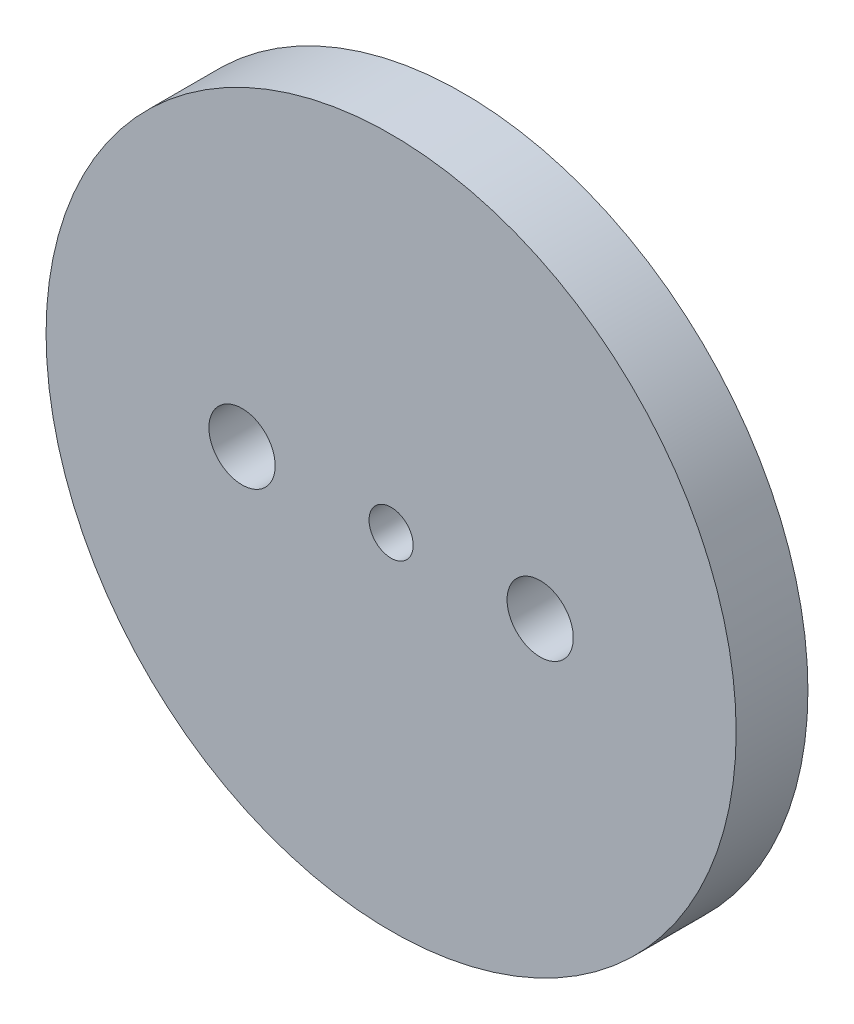
ISO-10303-21;
HEADER;
FILE_DESCRIPTION(('STEP AP214'),'2;1');
FILE_NAME('part.step','',(''),(''),'','','');
FILE_SCHEMA(('AUTOMOTIVE_DESIGN { 1 0 10303 214 1 1 1 1 }'));
ENDSEC;
DATA;
#1=APPLICATION_CONTEXT('core data for automotive mechanical design processes');
#2=APPLICATION_PROTOCOL_DEFINITION('international standard','automotive_design',2000,#1);
#3=PRODUCT_CONTEXT('',#1,'mechanical');
#4=PRODUCT('Part','Part','',(#3));
#5=PRODUCT_RELATED_PRODUCT_CATEGORY('part','',(#4));
#6=PRODUCT_DEFINITION_FORMATION('','',#4);
#7=PRODUCT_DEFINITION_CONTEXT('part definition',#1,'design');
#8=PRODUCT_DEFINITION('design','',#6,#7);
#9=PRODUCT_DEFINITION_SHAPE('','',#8);
#10=(LENGTH_UNIT() NAMED_UNIT(*) SI_UNIT(.MILLI.,.METRE.));
#11=(NAMED_UNIT(*) PLANE_ANGLE_UNIT() SI_UNIT($,.RADIAN.));
#12=(NAMED_UNIT(*) SI_UNIT($,.STERADIAN.) SOLID_ANGLE_UNIT());
#13=UNCERTAINTY_MEASURE_WITH_UNIT(LENGTH_MEASURE(1.E-05),#10,'distance_accuracy_value','');
#14=(GEOMETRIC_REPRESENTATION_CONTEXT(3) GLOBAL_UNCERTAINTY_ASSIGNED_CONTEXT((#13)) GLOBAL_UNIT_ASSIGNED_CONTEXT((#10,
#11,#12)) REPRESENTATION_CONTEXT('',''));
#15=CARTESIAN_POINT('',(0.,0.,0.));
#16=DIRECTION('',(0.,0.,1.));
#17=DIRECTION('',(1.,0.,0.));
#18=AXIS2_PLACEMENT_3D('',#15,#16,#17);
#19=CARTESIAN_POINT('',(0.,0.,13.));
#20=DIRECTION('',(0.,0.,1.));
#21=DIRECTION('',(1.,0.,0.));
#22=AXIS2_PLACEMENT_3D('',#19,#20,#21);
#23=PLANE('',#22);
#24=CARTESIAN_POINT('',(0.,0.,13.));
#25=DIRECTION('',(0.,0.,1.));
#26=DIRECTION('',(1.,0.,0.));
#27=AXIS2_PLACEMENT_3D('',#24,#25,#26);
#28=CIRCLE('',#27,4.);
#29=CARTESIAN_POINT('',(4.,0.,13.));
#30=VERTEX_POINT('',#29);
#31=EDGE_CURVE('E67',#30,#30,#28,.T.);
#32=ORIENTED_EDGE('',*,*,#31,.F.);
#33=EDGE_LOOP('',(#32));
#34=FACE_BOUND('',#33,.T.);
#35=CARTESIAN_POINT('',(27.,0.,13.));
#36=DIRECTION('',(0.,0.,1.));
#37=DIRECTION('',(1.,0.,0.));
#38=AXIS2_PLACEMENT_3D('',#35,#36,#37);
#39=CIRCLE('',#38,6.);
#40=CARTESIAN_POINT('',(21.,0.,13.));
#41=VERTEX_POINT('',#40);
#42=EDGE_CURVE('E49',#41,#41,#39,.T.);
#43=ORIENTED_EDGE('',*,*,#42,.F.);
#44=EDGE_LOOP('',(#43));
#45=FACE_BOUND('',#44,.T.);
#46=CARTESIAN_POINT('',(0.,0.,13.));
#47=DIRECTION('',(0.,0.,1.));
#48=DIRECTION('',(1.,0.,0.));
#49=AXIS2_PLACEMENT_3D('',#46,#47,#48);
#50=CIRCLE('',#49,62.5);
#51=CARTESIAN_POINT('',(-62.5,0.,13.));
#52=VERTEX_POINT('',#51);
#53=EDGE_CURVE('E10',#52,#52,#50,.T.);
#54=ORIENTED_EDGE('',*,*,#53,.T.);
#55=EDGE_LOOP('',(#54));
#56=FACE_BOUND('',#55,.T.);
#57=CARTESIAN_POINT('',(-27.,0.,13.));
#58=DIRECTION('',(0.,0.,1.));
#59=DIRECTION('',(-1.,0.,0.));
#60=AXIS2_PLACEMENT_3D('',#57,#58,#59);
#61=CIRCLE('',#60,6.);
#62=CARTESIAN_POINT('',(-33.,0.,13.));
#63=VERTEX_POINT('',#62);
#64=EDGE_CURVE('E55',#63,#63,#61,.T.);
#65=ORIENTED_EDGE('',*,*,#64,.F.);
#66=EDGE_LOOP('',(#65));
#67=FACE_BOUND('',#66,.T.);
#68=ADVANCED_FACE('F36',(#34,#45,#56,#67),#23,.T.);
#69=CARTESIAN_POINT('',(0.,0.,0.));
#70=DIRECTION('',(0.,0.,1.));
#71=DIRECTION('',(1.,0.,0.));
#72=AXIS2_PLACEMENT_3D('',#69,#70,#71);
#73=PLANE('',#72);
#74=CARTESIAN_POINT('',(0.,0.,0.));
#75=DIRECTION('',(0.,0.,1.));
#76=DIRECTION('',(1.,0.,0.));
#77=AXIS2_PLACEMENT_3D('',#74,#75,#76);
#78=CIRCLE('',#77,4.);
#79=CARTESIAN_POINT('',(4.,0.,0.));
#80=VERTEX_POINT('',#79);
#81=EDGE_CURVE('E63',#80,#80,#78,.T.);
#82=ORIENTED_EDGE('',*,*,#81,.T.);
#83=EDGE_LOOP('',(#82));
#84=FACE_BOUND('',#83,.T.);
#85=CARTESIAN_POINT('',(0.,0.,0.));
#86=DIRECTION('',(0.,0.,1.));
#87=DIRECTION('',(1.,0.,0.));
#88=AXIS2_PLACEMENT_3D('',#85,#86,#87);
#89=CIRCLE('',#88,62.5);
#90=CARTESIAN_POINT('',(-62.5,0.,0.));
#91=VERTEX_POINT('',#90);
#92=EDGE_CURVE('E40',#91,#91,#89,.T.);
#93=ORIENTED_EDGE('',*,*,#92,.F.);
#94=EDGE_LOOP('',(#93));
#95=FACE_BOUND('',#94,.T.);
#96=CARTESIAN_POINT('',(27.,0.,0.));
#97=DIRECTION('',(0.,0.,1.));
#98=DIRECTION('',(1.,0.,0.));
#99=AXIS2_PLACEMENT_3D('',#96,#97,#98);
#100=CIRCLE('',#99,6.);
#101=CARTESIAN_POINT('',(21.,0.,0.));
#102=VERTEX_POINT('',#101);
#103=EDGE_CURVE('E51',#102,#102,#100,.T.);
#104=ORIENTED_EDGE('',*,*,#103,.T.);
#105=EDGE_LOOP('',(#104));
#106=FACE_BOUND('',#105,.T.);
#107=CARTESIAN_POINT('',(-27.,0.,0.));
#108=DIRECTION('',(0.,0.,1.));
#109=DIRECTION('',(-1.,0.,0.));
#110=AXIS2_PLACEMENT_3D('',#107,#108,#109);
#111=CIRCLE('',#110,6.);
#112=CARTESIAN_POINT('',(-33.,0.,0.));
#113=VERTEX_POINT('',#112);
#114=EDGE_CURVE('E59',#113,#113,#111,.T.);
#115=ORIENTED_EDGE('',*,*,#114,.T.);
#116=EDGE_LOOP('',(#115));
#117=FACE_BOUND('',#116,.T.);
#118=ADVANCED_FACE('F75',(#84,#95,#106,#117),#73,.F.);
#119=CARTESIAN_POINT('',(0.,0.,13.));
#120=DIRECTION('',(0.,0.,-1.));
#121=DIRECTION('',(-1.,0.,0.));
#122=AXIS2_PLACEMENT_3D('',#119,#120,#121);
#123=CYLINDRICAL_SURFACE('',#122,62.5);
#124=CARTESIAN_POINT('',(-62.5,0.,13.));
#125=CARTESIAN_POINT('',(-62.5,0.,12.8645833333333));
#126=CARTESIAN_POINT('',(-62.5,0.,12.7291666666667));
#127=CARTESIAN_POINT('',(-62.5,0.,12.4583333333333));
#128=CARTESIAN_POINT('',(-62.5,0.,12.3229166666667));
#129=CARTESIAN_POINT('',(-62.5,0.,12.0520833333333));
#130=CARTESIAN_POINT('',(-62.5,0.,11.9166666666667));
#131=CARTESIAN_POINT('',(-62.5,0.,11.6458333333333));
#132=CARTESIAN_POINT('',(-62.5,0.,11.5104166666667));
#133=CARTESIAN_POINT('',(-62.5,0.,11.2395833333333));
#134=CARTESIAN_POINT('',(-62.5,0.,11.1041666666667));
#135=CARTESIAN_POINT('',(-62.5,0.,10.8333333333333));
#136=CARTESIAN_POINT('',(-62.5,0.,10.6979166666667));
#137=CARTESIAN_POINT('',(-62.5,0.,10.4270833333333));
#138=CARTESIAN_POINT('',(-62.5,0.,10.2916666666667));
#139=CARTESIAN_POINT('',(-62.5,0.,10.0208333333333));
#140=CARTESIAN_POINT('',(-62.5,0.,9.88541666666667));
#141=CARTESIAN_POINT('',(-62.5,0.,9.61458333333333));
#142=CARTESIAN_POINT('',(-62.5,0.,9.47916666666667));
#143=CARTESIAN_POINT('',(-62.5,0.,9.20833333333333));
#144=CARTESIAN_POINT('',(-62.5,0.,9.07291666666667));
#145=CARTESIAN_POINT('',(-62.5,0.,8.80208333333333));
#146=CARTESIAN_POINT('',(-62.5,0.,8.66666666666667));
#147=CARTESIAN_POINT('',(-62.5,0.,8.39583333333333));
#148=CARTESIAN_POINT('',(-62.5,0.,8.26041666666667));
#149=CARTESIAN_POINT('',(-62.5,0.,7.98958333333333));
#150=CARTESIAN_POINT('',(-62.5,0.,7.85416666666667));
#151=CARTESIAN_POINT('',(-62.5,0.,7.58333333333333));
#152=CARTESIAN_POINT('',(-62.5,0.,7.44791666666667));
#153=CARTESIAN_POINT('',(-62.5,0.,7.17708333333333));
#154=CARTESIAN_POINT('',(-62.5,0.,7.04166666666667));
#155=CARTESIAN_POINT('',(-62.5,0.,6.77083333333333));
#156=CARTESIAN_POINT('',(-62.5,0.,6.63541666666667));
#157=CARTESIAN_POINT('',(-62.5,0.,6.36458333333333));
#158=CARTESIAN_POINT('',(-62.5,0.,6.22916666666667));
#159=CARTESIAN_POINT('',(-62.5,0.,5.95833333333333));
#160=CARTESIAN_POINT('',(-62.5,0.,5.82291666666667));
#161=CARTESIAN_POINT('',(-62.5,0.,5.55208333333333));
#162=CARTESIAN_POINT('',(-62.5,0.,5.41666666666667));
#163=CARTESIAN_POINT('',(-62.5,0.,5.14583333333333));
#164=CARTESIAN_POINT('',(-62.5,0.,5.01041666666667));
#165=CARTESIAN_POINT('',(-62.5,0.,4.73958333333333));
#166=CARTESIAN_POINT('',(-62.5,0.,4.60416666666667));
#167=CARTESIAN_POINT('',(-62.5,0.,4.33333333333333));
#168=CARTESIAN_POINT('',(-62.5,0.,4.19791666666667));
#169=CARTESIAN_POINT('',(-62.5,0.,3.92708333333333));
#170=CARTESIAN_POINT('',(-62.5,0.,3.79166666666667));
#171=CARTESIAN_POINT('',(-62.5,0.,3.52083333333333));
#172=CARTESIAN_POINT('',(-62.5,0.,3.38541666666667));
#173=CARTESIAN_POINT('',(-62.5,0.,3.11458333333333));
#174=CARTESIAN_POINT('',(-62.5,0.,2.97916666666667));
#175=CARTESIAN_POINT('',(-62.5,0.,2.70833333333333));
#176=CARTESIAN_POINT('',(-62.5,0.,2.57291666666667));
#177=CARTESIAN_POINT('',(-62.5,0.,2.30208333333333));
#178=CARTESIAN_POINT('',(-62.5,0.,2.16666666666667));
#179=CARTESIAN_POINT('',(-62.5,0.,1.89583333333333));
#180=CARTESIAN_POINT('',(-62.5,0.,1.76041666666667));
#181=CARTESIAN_POINT('',(-62.5,0.,1.48958333333333));
#182=CARTESIAN_POINT('',(-62.5,0.,1.35416666666667));
#183=CARTESIAN_POINT('',(-62.5,0.,1.08333333333333));
#184=CARTESIAN_POINT('',(-62.5,0.,0.947916666666667));
#185=CARTESIAN_POINT('',(-62.5,0.,0.677083333333334));
#186=CARTESIAN_POINT('',(-62.5,0.,0.541666666666667));
#187=CARTESIAN_POINT('',(-62.5,0.,0.270833333333334));
#188=CARTESIAN_POINT('',(-62.5,0.,0.135416666666667));
#189=CARTESIAN_POINT('',(-62.5,0.,0.));
#190=B_SPLINE_CURVE_WITH_KNOTS('',3,(#124,#125,#126,#127,#128,#129,#130,#131,#132,#133,#134,
#135,#136,#137,#138,#139,#140,#141,#142,#143,#144,#145,#146,#147,#148,#149,#150,#151,#152,#153,
#154,#155,#156,#157,#158,#159,#160,#161,#162,#163,#164,#165,#166,#167,#168,#169,#170,#171,#172,
#173,#174,#175,#176,#177,#178,#179,#180,#181,#182,#183,#184,#185,#186,#187,#188,#189),
.UNSPECIFIED.,.F.,.F.,(4,2,2,2,2,2,2,2,2,2,2,2,2,2,2,2,2,2,2,2,2,2,2,2,2,2,2,2,2,2,2,2,4),(0.,
0.406249999999999,0.812499999999999,1.21875,1.625,2.03125,2.4375,2.84375,3.25,3.65625,4.0625,
4.46875,4.875,5.28125,5.6875,6.09375,6.5,6.90625,7.3125,7.71875,8.125,8.53125,8.9375,9.34375,
9.75,10.15625,10.5625,10.96875,11.375,11.78125,12.1875,12.59375,13.),.UNSPECIFIED.);
#191=EDGE_CURVE('BSEAM38',#52,#91,#190,.T.);
#192=ORIENTED_EDGE('',*,*,#53,.F.);
#193=ORIENTED_EDGE('',*,*,#92,.T.);
#194=ORIENTED_EDGE('',*,*,#191,.T.);
#195=ORIENTED_EDGE('',*,*,#191,.F.);
#196=EDGE_LOOP('',(#192,#194,#193,#195));
#197=FACE_BOUND('',#196,.T.);
#198=ADVANCED_FACE('F38',(#197),#123,.T.);
#199=CARTESIAN_POINT('',(27.,0.,13.));
#200=DIRECTION('',(0.,0.,-1.));
#201=DIRECTION('',(-1.,0.,0.));
#202=AXIS2_PLACEMENT_3D('',#199,#200,#201);
#203=CYLINDRICAL_SURFACE('',#202,6.);
#204=CARTESIAN_POINT('',(21.,0.,13.));
#205=CARTESIAN_POINT('',(21.,0.,12.8645833333333));
#206=CARTESIAN_POINT('',(21.,0.,12.7291666666667));
#207=CARTESIAN_POINT('',(21.,0.,12.4583333333333));
#208=CARTESIAN_POINT('',(21.,0.,12.3229166666667));
#209=CARTESIAN_POINT('',(21.,0.,12.0520833333333));
#210=CARTESIAN_POINT('',(21.,0.,11.9166666666667));
#211=CARTESIAN_POINT('',(21.,0.,11.6458333333333));
#212=CARTESIAN_POINT('',(21.,0.,11.5104166666667));
#213=CARTESIAN_POINT('',(21.,0.,11.2395833333333));
#214=CARTESIAN_POINT('',(21.,0.,11.1041666666667));
#215=CARTESIAN_POINT('',(21.,0.,10.8333333333333));
#216=CARTESIAN_POINT('',(21.,0.,10.6979166666667));
#217=CARTESIAN_POINT('',(21.,0.,10.4270833333333));
#218=CARTESIAN_POINT('',(21.,0.,10.2916666666667));
#219=CARTESIAN_POINT('',(21.,0.,10.0208333333333));
#220=CARTESIAN_POINT('',(21.,0.,9.88541666666667));
#221=CARTESIAN_POINT('',(21.,0.,9.61458333333333));
#222=CARTESIAN_POINT('',(21.,0.,9.47916666666667));
#223=CARTESIAN_POINT('',(21.,0.,9.20833333333333));
#224=CARTESIAN_POINT('',(21.,0.,9.07291666666666));
#225=CARTESIAN_POINT('',(21.,0.,8.80208333333333));
#226=CARTESIAN_POINT('',(21.,0.,8.66666666666667));
#227=CARTESIAN_POINT('',(21.,0.,8.39583333333333));
#228=CARTESIAN_POINT('',(21.,0.,8.26041666666667));
#229=CARTESIAN_POINT('',(21.,0.,7.98958333333333));
#230=CARTESIAN_POINT('',(21.,0.,7.85416666666667));
#231=CARTESIAN_POINT('',(21.,0.,7.58333333333333));
#232=CARTESIAN_POINT('',(21.,0.,7.44791666666667));
#233=CARTESIAN_POINT('',(21.,0.,7.17708333333333));
#234=CARTESIAN_POINT('',(21.,0.,7.04166666666667));
#235=CARTESIAN_POINT('',(21.,0.,6.77083333333333));
#236=CARTESIAN_POINT('',(21.,0.,6.63541666666667));
#237=CARTESIAN_POINT('',(21.,0.,6.36458333333333));
#238=CARTESIAN_POINT('',(21.,0.,6.22916666666667));
#239=CARTESIAN_POINT('',(21.,0.,5.95833333333333));
#240=CARTESIAN_POINT('',(21.,0.,5.82291666666667));
#241=CARTESIAN_POINT('',(21.,0.,5.55208333333333));
#242=CARTESIAN_POINT('',(21.,0.,5.41666666666667));
#243=CARTESIAN_POINT('',(21.,0.,5.14583333333333));
#244=CARTESIAN_POINT('',(21.,0.,5.01041666666667));
#245=CARTESIAN_POINT('',(21.,0.,4.73958333333333));
#246=CARTESIAN_POINT('',(21.,0.,4.60416666666667));
#247=CARTESIAN_POINT('',(21.,0.,4.33333333333333));
#248=CARTESIAN_POINT('',(21.,0.,4.19791666666667));
#249=CARTESIAN_POINT('',(21.,0.,3.92708333333333));
#250=CARTESIAN_POINT('',(21.,0.,3.79166666666667));
#251=CARTESIAN_POINT('',(21.,0.,3.52083333333333));
#252=CARTESIAN_POINT('',(21.,0.,3.38541666666667));
#253=CARTESIAN_POINT('',(21.,0.,3.11458333333333));
#254=CARTESIAN_POINT('',(21.,0.,2.97916666666667));
#255=CARTESIAN_POINT('',(21.,0.,2.70833333333333));
#256=CARTESIAN_POINT('',(21.,0.,2.57291666666667));
#257=CARTESIAN_POINT('',(21.,0.,2.30208333333333));
#258=CARTESIAN_POINT('',(21.,0.,2.16666666666667));
#259=CARTESIAN_POINT('',(21.,0.,1.89583333333333));
#260=CARTESIAN_POINT('',(21.,0.,1.76041666666667));
#261=CARTESIAN_POINT('',(21.,0.,1.48958333333333));
#262=CARTESIAN_POINT('',(21.,0.,1.35416666666667));
#263=CARTESIAN_POINT('',(21.,0.,1.08333333333333));
#264=CARTESIAN_POINT('',(21.,0.,0.947916666666667));
#265=CARTESIAN_POINT('',(21.,0.,0.677083333333334));
#266=CARTESIAN_POINT('',(21.,0.,0.541666666666667));
#267=CARTESIAN_POINT('',(21.,0.,0.270833333333334));
#268=CARTESIAN_POINT('',(21.,0.,0.135416666666667));
#269=CARTESIAN_POINT('',(21.,0.,0.));
#270=B_SPLINE_CURVE_WITH_KNOTS('',3,(#204,#205,#206,#207,#208,#209,#210,#211,#212,#213,#214,
#215,#216,#217,#218,#219,#220,#221,#222,#223,#224,#225,#226,#227,#228,#229,#230,#231,#232,#233,
#234,#235,#236,#237,#238,#239,#240,#241,#242,#243,#244,#245,#246,#247,#248,#249,#250,#251,#252,
#253,#254,#255,#256,#257,#258,#259,#260,#261,#262,#263,#264,#265,#266,#267,#268,#269),
.UNSPECIFIED.,.F.,.F.,(4,2,2,2,2,2,2,2,2,2,2,2,2,2,2,2,2,2,2,2,2,2,2,2,2,2,2,2,2,2,2,2,4),(0.,
0.40625,0.812500000000001,1.21875,1.625,2.03125,2.4375,2.84375,3.25,3.65625,4.0625,4.46875,
4.875,5.28125,5.6875,6.09375,6.5,6.90625,7.3125,7.71875,8.125,8.53125,8.9375,9.34375,9.75,
10.15625,10.5625,10.96875,11.375,11.78125,12.1875,12.59375,13.),.UNSPECIFIED.);
#271=EDGE_CURVE('BSEAM94',#41,#102,#270,.T.);
#272=ORIENTED_EDGE('',*,*,#42,.T.);
#273=ORIENTED_EDGE('',*,*,#103,.F.);
#274=ORIENTED_EDGE('',*,*,#271,.T.);
#275=ORIENTED_EDGE('',*,*,#271,.F.);
#276=EDGE_LOOP('',(#272,#274,#273,#275));
#277=FACE_BOUND('',#276,.T.);
#278=ADVANCED_FACE('F94',(#277),#203,.F.);
#279=CARTESIAN_POINT('',(-27.,0.,13.));
#280=DIRECTION('',(0.,0.,-1.));
#281=DIRECTION('',(-1.,0.,0.));
#282=AXIS2_PLACEMENT_3D('',#279,#280,#281);
#283=CYLINDRICAL_SURFACE('',#282,6.);
#284=CARTESIAN_POINT('',(-33.,0.,13.));
#285=CARTESIAN_POINT('',(-33.,0.,12.8645833333333));
#286=CARTESIAN_POINT('',(-33.,0.,12.7291666666667));
#287=CARTESIAN_POINT('',(-33.,0.,12.4583333333333));
#288=CARTESIAN_POINT('',(-33.,0.,12.3229166666667));
#289=CARTESIAN_POINT('',(-33.,0.,12.0520833333333));
#290=CARTESIAN_POINT('',(-33.,0.,11.9166666666667));
#291=CARTESIAN_POINT('',(-33.,0.,11.6458333333333));
#292=CARTESIAN_POINT('',(-33.,0.,11.5104166666667));
#293=CARTESIAN_POINT('',(-33.,0.,11.2395833333333));
#294=CARTESIAN_POINT('',(-33.,0.,11.1041666666667));
#295=CARTESIAN_POINT('',(-33.,0.,10.8333333333333));
#296=CARTESIAN_POINT('',(-33.,0.,10.6979166666667));
#297=CARTESIAN_POINT('',(-33.,0.,10.4270833333333));
#298=CARTESIAN_POINT('',(-33.,0.,10.2916666666667));
#299=CARTESIAN_POINT('',(-33.,0.,10.0208333333333));
#300=CARTESIAN_POINT('',(-33.,0.,9.88541666666667));
#301=CARTESIAN_POINT('',(-33.,0.,9.61458333333333));
#302=CARTESIAN_POINT('',(-33.,0.,9.47916666666667));
#303=CARTESIAN_POINT('',(-33.,0.,9.20833333333333));
#304=CARTESIAN_POINT('',(-33.,0.,9.07291666666666));
#305=CARTESIAN_POINT('',(-33.,0.,8.80208333333333));
#306=CARTESIAN_POINT('',(-33.,0.,8.66666666666667));
#307=CARTESIAN_POINT('',(-33.,0.,8.39583333333333));
#308=CARTESIAN_POINT('',(-33.,0.,8.26041666666667));
#309=CARTESIAN_POINT('',(-33.,0.,7.98958333333333));
#310=CARTESIAN_POINT('',(-33.,0.,7.85416666666667));
#311=CARTESIAN_POINT('',(-33.,0.,7.58333333333333));
#312=CARTESIAN_POINT('',(-33.,0.,7.44791666666667));
#313=CARTESIAN_POINT('',(-33.,0.,7.17708333333333));
#314=CARTESIAN_POINT('',(-33.,0.,7.04166666666667));
#315=CARTESIAN_POINT('',(-33.,0.,6.77083333333333));
#316=CARTESIAN_POINT('',(-33.,0.,6.63541666666667));
#317=CARTESIAN_POINT('',(-33.,0.,6.36458333333333));
#318=CARTESIAN_POINT('',(-33.,0.,6.22916666666667));
#319=CARTESIAN_POINT('',(-33.,0.,5.95833333333333));
#320=CARTESIAN_POINT('',(-33.,0.,5.82291666666667));
#321=CARTESIAN_POINT('',(-33.,0.,5.55208333333333));
#322=CARTESIAN_POINT('',(-33.,0.,5.41666666666667));
#323=CARTESIAN_POINT('',(-33.,0.,5.14583333333333));
#324=CARTESIAN_POINT('',(-33.,0.,5.01041666666667));
#325=CARTESIAN_POINT('',(-33.,0.,4.73958333333333));
#326=CARTESIAN_POINT('',(-33.,0.,4.60416666666667));
#327=CARTESIAN_POINT('',(-33.,0.,4.33333333333333));
#328=CARTESIAN_POINT('',(-33.,0.,4.19791666666667));
#329=CARTESIAN_POINT('',(-33.,0.,3.92708333333333));
#330=CARTESIAN_POINT('',(-33.,0.,3.79166666666667));
#331=CARTESIAN_POINT('',(-33.,0.,3.52083333333333));
#332=CARTESIAN_POINT('',(-33.,0.,3.38541666666667));
#333=CARTESIAN_POINT('',(-33.,0.,3.11458333333333));
#334=CARTESIAN_POINT('',(-33.,0.,2.97916666666667));
#335=CARTESIAN_POINT('',(-33.,0.,2.70833333333333));
#336=CARTESIAN_POINT('',(-33.,0.,2.57291666666667));
#337=CARTESIAN_POINT('',(-33.,0.,2.30208333333333));
#338=CARTESIAN_POINT('',(-33.,0.,2.16666666666667));
#339=CARTESIAN_POINT('',(-33.,0.,1.89583333333333));
#340=CARTESIAN_POINT('',(-33.,0.,1.76041666666667));
#341=CARTESIAN_POINT('',(-33.,0.,1.48958333333333));
#342=CARTESIAN_POINT('',(-33.,0.,1.35416666666667));
#343=CARTESIAN_POINT('',(-33.,0.,1.08333333333333));
#344=CARTESIAN_POINT('',(-33.,0.,0.947916666666667));
#345=CARTESIAN_POINT('',(-33.,0.,0.677083333333334));
#346=CARTESIAN_POINT('',(-33.,0.,0.541666666666667));
#347=CARTESIAN_POINT('',(-33.,0.,0.270833333333334));
#348=CARTESIAN_POINT('',(-33.,0.,0.135416666666667));
#349=CARTESIAN_POINT('',(-33.,0.,0.));
#350=B_SPLINE_CURVE_WITH_KNOTS('',3,(#284,#285,#286,#287,#288,#289,#290,#291,#292,#293,#294,
#295,#296,#297,#298,#299,#300,#301,#302,#303,#304,#305,#306,#307,#308,#309,#310,#311,#312,#313,
#314,#315,#316,#317,#318,#319,#320,#321,#322,#323,#324,#325,#326,#327,#328,#329,#330,#331,#332,
#333,#334,#335,#336,#337,#338,#339,#340,#341,#342,#343,#344,#345,#346,#347,#348,#349),
.UNSPECIFIED.,.F.,.F.,(4,2,2,2,2,2,2,2,2,2,2,2,2,2,2,2,2,2,2,2,2,2,2,2,2,2,2,2,2,2,2,2,4),(0.,
0.40625,0.812500000000001,1.21875,1.625,2.03125,2.4375,2.84375,3.25,3.65625,4.0625,4.46875,
4.875,5.28125,5.6875,6.09375,6.5,6.90625,7.3125,7.71875,8.125,8.53125,8.9375,9.34375,9.75,
10.15625,10.5625,10.96875,11.375,11.78125,12.1875,12.59375,13.),.UNSPECIFIED.);
#351=EDGE_CURVE('BSEAM81',#63,#113,#350,.T.);
#352=ORIENTED_EDGE('',*,*,#64,.T.);
#353=ORIENTED_EDGE('',*,*,#114,.F.);
#354=ORIENTED_EDGE('',*,*,#351,.T.);
#355=ORIENTED_EDGE('',*,*,#351,.F.);
#356=EDGE_LOOP('',(#352,#354,#353,#355));
#357=FACE_BOUND('',#356,.T.);
#358=ADVANCED_FACE('F81',(#357),#283,.F.);
#359=CARTESIAN_POINT('',(0.,0.,0.));
#360=DIRECTION('',(0.,0.,1.));
#361=DIRECTION('',(1.,0.,0.));
#362=AXIS2_PLACEMENT_3D('',#359,#360,#361);
#363=CYLINDRICAL_SURFACE('',#362,4.);
#364=CARTESIAN_POINT('',(4.,0.,0.));
#365=CARTESIAN_POINT('',(4.,0.,0.135416666666666));
#366=CARTESIAN_POINT('',(4.,0.,0.270833333333333));
#367=CARTESIAN_POINT('',(4.,0.,0.541666666666667));
#368=CARTESIAN_POINT('',(4.,0.,0.677083333333333));
#369=CARTESIAN_POINT('',(4.,0.,0.947916666666667));
#370=CARTESIAN_POINT('',(4.,0.,1.08333333333333));
#371=CARTESIAN_POINT('',(4.,0.,1.35416666666667));
#372=CARTESIAN_POINT('',(4.,0.,1.48958333333333));
#373=CARTESIAN_POINT('',(4.,0.,1.76041666666667));
#374=CARTESIAN_POINT('',(4.,0.,1.89583333333333));
#375=CARTESIAN_POINT('',(4.,0.,2.16666666666667));
#376=CARTESIAN_POINT('',(4.,0.,2.30208333333333));
#377=CARTESIAN_POINT('',(4.,0.,2.57291666666667));
#378=CARTESIAN_POINT('',(4.,0.,2.70833333333333));
#379=CARTESIAN_POINT('',(4.,0.,2.97916666666667));
#380=CARTESIAN_POINT('',(4.,0.,3.11458333333333));
#381=CARTESIAN_POINT('',(4.,0.,3.38541666666667));
#382=CARTESIAN_POINT('',(4.,0.,3.52083333333333));
#383=CARTESIAN_POINT('',(4.,0.,3.79166666666667));
#384=CARTESIAN_POINT('',(4.,0.,3.92708333333333));
#385=CARTESIAN_POINT('',(4.,0.,4.19791666666667));
#386=CARTESIAN_POINT('',(4.,0.,4.33333333333333));
#387=CARTESIAN_POINT('',(4.,0.,4.60416666666667));
#388=CARTESIAN_POINT('',(4.,0.,4.73958333333333));
#389=CARTESIAN_POINT('',(4.,0.,5.01041666666667));
#390=CARTESIAN_POINT('',(4.,0.,5.14583333333333));
#391=CARTESIAN_POINT('',(4.,0.,5.41666666666667));
#392=CARTESIAN_POINT('',(4.,0.,5.55208333333333));
#393=CARTESIAN_POINT('',(4.,0.,5.82291666666667));
#394=CARTESIAN_POINT('',(4.,0.,5.95833333333333));
#395=CARTESIAN_POINT('',(4.,0.,6.22916666666667));
#396=CARTESIAN_POINT('',(4.,0.,6.36458333333333));
#397=CARTESIAN_POINT('',(4.,0.,6.63541666666667));
#398=CARTESIAN_POINT('',(4.,0.,6.77083333333333));
#399=CARTESIAN_POINT('',(4.,0.,7.04166666666667));
#400=CARTESIAN_POINT('',(4.,0.,7.17708333333333));
#401=CARTESIAN_POINT('',(4.,0.,7.44791666666667));
#402=CARTESIAN_POINT('',(4.,0.,7.58333333333333));
#403=CARTESIAN_POINT('',(4.,0.,7.85416666666667));
#404=CARTESIAN_POINT('',(4.,0.,7.98958333333333));
#405=CARTESIAN_POINT('',(4.,0.,8.26041666666667));
#406=CARTESIAN_POINT('',(4.,0.,8.39583333333333));
#407=CARTESIAN_POINT('',(4.,0.,8.66666666666667));
#408=CARTESIAN_POINT('',(4.,0.,8.80208333333333));
#409=CARTESIAN_POINT('',(4.,0.,9.07291666666667));
#410=CARTESIAN_POINT('',(4.,0.,9.20833333333333));
#411=CARTESIAN_POINT('',(4.,0.,9.47916666666667));
#412=CARTESIAN_POINT('',(4.,0.,9.61458333333333));
#413=CARTESIAN_POINT('',(4.,0.,9.88541666666667));
#414=CARTESIAN_POINT('',(4.,0.,10.0208333333333));
#415=CARTESIAN_POINT('',(4.,0.,10.2916666666667));
#416=CARTESIAN_POINT('',(4.,0.,10.4270833333333));
#417=CARTESIAN_POINT('',(4.,0.,10.6979166666667));
#418=CARTESIAN_POINT('',(4.,0.,10.8333333333333));
#419=CARTESIAN_POINT('',(4.,0.,11.1041666666667));
#420=CARTESIAN_POINT('',(4.,0.,11.2395833333333));
#421=CARTESIAN_POINT('',(4.,0.,11.5104166666667));
#422=CARTESIAN_POINT('',(4.,0.,11.6458333333333));
#423=CARTESIAN_POINT('',(4.,0.,11.9166666666667));
#424=CARTESIAN_POINT('',(4.,0.,12.0520833333333));
#425=CARTESIAN_POINT('',(4.,0.,12.3229166666667));
#426=CARTESIAN_POINT('',(4.,0.,12.4583333333333));
#427=CARTESIAN_POINT('',(4.,0.,12.7291666666667));
#428=CARTESIAN_POINT('',(4.,0.,12.8645833333333));
#429=CARTESIAN_POINT('',(4.,0.,13.));
#430=B_SPLINE_CURVE_WITH_KNOTS('',3,(#364,#365,#366,#367,#368,#369,#370,#371,#372,#373,#374,
#375,#376,#377,#378,#379,#380,#381,#382,#383,#384,#385,#386,#387,#388,#389,#390,#391,#392,#393,
#394,#395,#396,#397,#398,#399,#400,#401,#402,#403,#404,#405,#406,#407,#408,#409,#410,#411,#412,
#413,#414,#415,#416,#417,#418,#419,#420,#421,#422,#423,#424,#425,#426,#427,#428,#429),
.UNSPECIFIED.,.F.,.F.,(4,2,2,2,2,2,2,2,2,2,2,2,2,2,2,2,2,2,2,2,2,2,2,2,2,2,2,2,2,2,2,2,4),(0.,
0.40625,0.8125,1.21875,1.625,2.03125,2.4375,2.84375,3.25,3.65625,4.0625,4.46875,4.875,5.28125,
5.6875,6.09375,6.5,6.90625,7.3125,7.71875,8.125,8.53125,8.9375,9.34375,9.75,10.15625,10.5625,
10.96875,11.375,11.78125,12.1875,12.59375,13.),.UNSPECIFIED.);
#431=EDGE_CURVE('BSEAM78',#80,#30,#430,.T.);
#432=ORIENTED_EDGE('',*,*,#81,.F.);
#433=ORIENTED_EDGE('',*,*,#31,.T.);
#434=ORIENTED_EDGE('',*,*,#431,.T.);
#435=ORIENTED_EDGE('',*,*,#431,.F.);
#436=EDGE_LOOP('',(#432,#434,#433,#435));
#437=FACE_BOUND('',#436,.T.);
#438=ADVANCED_FACE('F78',(#437),#363,.F.);
#439=CLOSED_SHELL('',(#68,#118,#198,#278,#358,#438));
#440=MANIFOLD_SOLID_BREP('B2',#439);
#441=ADVANCED_BREP_SHAPE_REPRESENTATION('',(#18,#440),#14);
#442=SHAPE_DEFINITION_REPRESENTATION(#9,#441);
ENDSEC;
END-ISO-10303-21;
